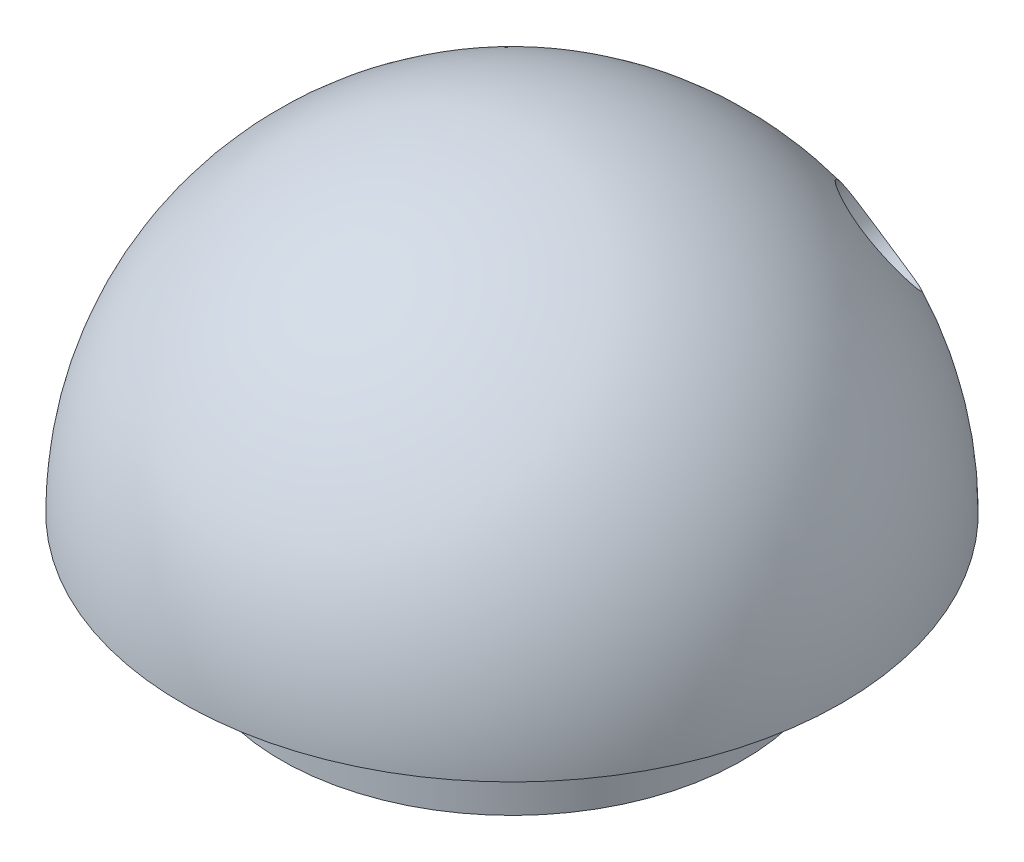
ISO-10303-21;
HEADER;
FILE_DESCRIPTION(('STEP AP214'),'2;1');
FILE_NAME('part.step','',(''),(''),'','','');
FILE_SCHEMA(('AUTOMOTIVE_DESIGN { 1 0 10303 214 1 1 1 1 }'));
ENDSEC;
DATA;
#1=APPLICATION_CONTEXT('core data for automotive mechanical design processes');
#2=APPLICATION_PROTOCOL_DEFINITION('international standard','automotive_design',2000,#1);
#3=PRODUCT_CONTEXT('',#1,'mechanical');
#4=PRODUCT('Part','Part','',(#3));
#5=PRODUCT_RELATED_PRODUCT_CATEGORY('part','',(#4));
#6=PRODUCT_DEFINITION_FORMATION('','',#4);
#7=PRODUCT_DEFINITION_CONTEXT('part definition',#1,'design');
#8=PRODUCT_DEFINITION('design','',#6,#7);
#9=PRODUCT_DEFINITION_SHAPE('','',#8);
#10=(LENGTH_UNIT() NAMED_UNIT(*) SI_UNIT(.MILLI.,.METRE.));
#11=(NAMED_UNIT(*) PLANE_ANGLE_UNIT() SI_UNIT($,.RADIAN.));
#12=(NAMED_UNIT(*) SI_UNIT($,.STERADIAN.) SOLID_ANGLE_UNIT());
#13=UNCERTAINTY_MEASURE_WITH_UNIT(LENGTH_MEASURE(1.E-05),#10,'distance_accuracy_value','');
#14=(GEOMETRIC_REPRESENTATION_CONTEXT(3) GLOBAL_UNCERTAINTY_ASSIGNED_CONTEXT((#13)) GLOBAL_UNIT_ASSIGNED_CONTEXT((#10,
#11,#12)) REPRESENTATION_CONTEXT('',''));
#15=CARTESIAN_POINT('',(0.,0.,0.));
#16=DIRECTION('',(0.,0.,1.));
#17=DIRECTION('',(1.,0.,0.));
#18=AXIS2_PLACEMENT_3D('',#15,#16,#17);
#19=CARTESIAN_POINT('',(15.,0.,0.));
#20=DIRECTION('',(0.,-1.,0.));
#21=DIRECTION('',(0.,0.,-1.));
#22=AXIS2_PLACEMENT_3D('',#19,#20,#21);
#23=PLANE('',#22);
#24=CARTESIAN_POINT('',(0.,0.,0.));
#25=DIRECTION('',(0.,-1.,0.));
#26=DIRECTION('',(0.,0.,-1.));
#27=AXIS2_PLACEMENT_3D('',#24,#25,#26);
#28=CIRCLE('',#27,17.5);
#29=CARTESIAN_POINT('',(0.,0.,-17.5));
#30=VERTEX_POINT('',#29);
#31=EDGE_CURVE('E10',#30,#30,#28,.T.);
#32=ORIENTED_EDGE('',*,*,#31,.T.);
#33=EDGE_LOOP('',(#32));
#34=FACE_BOUND('',#33,.T.);
#35=CARTESIAN_POINT('',(0.,0.,0.));
#36=DIRECTION('',(0.,-1.,0.));
#37=DIRECTION('',(0.,0.,-1.));
#38=AXIS2_PLACEMENT_3D('',#35,#36,#37);
#39=CIRCLE('',#38,15.);
#40=CARTESIAN_POINT('',(0.,0.,-15.));
#41=VERTEX_POINT('',#40);
#42=EDGE_CURVE('E115',#41,#41,#39,.T.);
#43=ORIENTED_EDGE('',*,*,#42,.F.);
#44=EDGE_LOOP('',(#43));
#45=FACE_BOUND('',#44,.T.);
#46=ADVANCED_FACE('F37',(#34,#45),#23,.T.);
#47=CARTESIAN_POINT('',(0.,0.,0.));
#48=DIRECTION('',(0.,-1.,0.));
#49=DIRECTION('',(0.,0.,-1.));
#50=AXIS2_PLACEMENT_3D('',#47,#48,#49);
#51=CYLINDRICAL_SURFACE('',#50,17.5);
#52=CARTESIAN_POINT('',(0.,7.5,0.));
#53=DIRECTION('',(0.,-1.,0.));
#54=DIRECTION('',(0.,0.,-1.));
#55=AXIS2_PLACEMENT_3D('',#52,#53,#54);
#56=CIRCLE('',#55,17.5);
#57=CARTESIAN_POINT('',(0.,7.5,-17.5));
#58=VERTEX_POINT('',#57);
#59=EDGE_CURVE('E50',#58,#58,#56,.T.);
#60=ORIENTED_EDGE('',*,*,#59,.T.);
#61=EDGE_LOOP('',(#60));
#62=FACE_BOUND('',#61,.T.);
#63=ORIENTED_EDGE('',*,*,#31,.F.);
#64=EDGE_LOOP('',(#63));
#65=FACE_BOUND('',#64,.T.);
#66=ADVANCED_FACE('F100',(#62,#65),#51,.T.);
#67=CARTESIAN_POINT('',(17.5,7.5,0.));
#68=DIRECTION('',(0.,-1.,0.));
#69=DIRECTION('',(0.,0.,-1.));
#70=AXIS2_PLACEMENT_3D('',#67,#68,#69);
#71=PLANE('',#70);
#72=CARTESIAN_POINT('',(0.,7.5,0.));
#73=DIRECTION('',(0.,-1.,0.));
#74=DIRECTION('',(0.,0.,-1.));
#75=AXIS2_PLACEMENT_3D('',#72,#73,#74);
#76=CIRCLE('',#75,25.);
#77=CARTESIAN_POINT('',(0.,7.5,-25.));
#78=VERTEX_POINT('',#77);
#79=EDGE_CURVE('E56',#78,#78,#76,.T.);
#80=ORIENTED_EDGE('',*,*,#79,.T.);
#81=EDGE_LOOP('',(#80));
#82=FACE_BOUND('',#81,.T.);
#83=ORIENTED_EDGE('',*,*,#59,.F.);
#84=EDGE_LOOP('',(#83));
#85=FACE_BOUND('',#84,.T.);
#86=ADVANCED_FACE('F96',(#82,#85),#71,.T.);
#87=CARTESIAN_POINT('',(0.,7.5,0.));
#88=DIRECTION('',(0.,-1.,0.));
#89=DIRECTION('',(1.,0.,0.));
#90=AXIS2_PLACEMENT_3D('',#87,#88,#89);
#91=SPHERICAL_SURFACE('',#90,25.);
#92=CARTESIAN_POINT('',(6.25615376132843,17.7963860629931,-21.9053640355272));
#93=CARTESIAN_POINT('',(6.18530853261183,17.8598773602726,-21.8957539216232));
#94=CARTESIAN_POINT('',(6.11707328099068,17.9258973139518,-21.8835833425738));
#95=CARTESIAN_POINT('',(5.98627087578441,18.0623590800766,-21.8542967360259));
#96=CARTESIAN_POINT('',(5.92370643525307,18.132802982048,-21.837178357614));
#97=CARTESIAN_POINT('',(5.80452764315806,18.2775200171955,-21.7982040112875));
#98=CARTESIAN_POINT('',(5.74792317265035,18.3517992143213,-21.7763403542723));
#99=CARTESIAN_POINT('',(5.64099343419435,18.503394607336,-21.728177589921));
#100=CARTESIAN_POINT('',(5.59067095453047,18.5807121319205,-21.7018765251184));
#101=CARTESIAN_POINT('',(5.44997969278555,18.8151541974207,-21.6171500484495));
#102=CARTESIAN_POINT('',(5.36901723398244,18.9758391330304,-21.5526093716431));
#103=CARTESIAN_POINT('',(5.23240734587209,19.3015131724903,-21.4098703816877));
#104=CARTESIAN_POINT('',(5.17675552257887,19.466501523995,-21.331674442389));
#105=CARTESIAN_POINT('',(5.08509325128873,19.8137203098701,-21.155566550009));
#106=CARTESIAN_POINT('',(5.05162712537946,19.9960128709896,-21.0564618699588));
#107=CARTESIAN_POINT('',(5.01164018242014,20.3572851393496,-20.847487003503));
#108=CARTESIAN_POINT('',(5.00513482011561,20.5362628879383,-20.7376106793844));
#109=CARTESIAN_POINT('',(5.0178433961382,20.9230843844761,-20.4867095871355));
#110=CARTESIAN_POINT('',(5.04245213585646,21.1295561935987,-20.3438460028755));
#111=CARTESIAN_POINT('',(5.12306725965867,21.5297750479752,-20.0495149718742));
#112=CARTESIAN_POINT('',(5.17909320785997,21.7235140802094,-19.8980422169012));
#113=CARTESIAN_POINT('',(5.33317133170666,22.1330152460234,-19.5582061333266));
#114=CARTESIAN_POINT('',(5.4374050298809,22.3453831970341,-19.3685446905883));
#115=CARTESIAN_POINT('',(5.6812946747763,22.744400248751,-18.9848052204471));
#116=CARTESIAN_POINT('',(5.8209855297742,22.9310237223994,-18.7907230131215));
#117=CARTESIAN_POINT('',(6.15503168719203,23.3007302621001,-18.3731646937419));
#118=CARTESIAN_POINT('',(6.35442023790692,23.4791896017891,-18.1495951660125));
#119=CARTESIAN_POINT('',(6.79057912513638,23.7921882587786,-17.7080004423529));
#120=CARTESIAN_POINT('',(7.0273378869575,23.9267411357976,-17.4899735538957));
#121=CARTESIAN_POINT('',(7.47516564380766,24.1187783895382,-17.1175049929497));
#122=CARTESIAN_POINT('',(7.67924416977037,24.186935463117,-16.9601398094682));
#123=CARTESIAN_POINT('',(8.10553421996632,24.2881379942026,-16.6592032696218));
#124=CARTESIAN_POINT('',(8.32771510488495,24.3212415049996,-16.5156094659465));
#125=CARTESIAN_POINT('',(8.72741304551039,24.3427529145637,-16.2847375663622));
#126=CARTESIAN_POINT('',(8.90155652512992,24.3405309528524,-16.1925157343167));
#127=CARTESIAN_POINT('',(9.25557110969807,24.3102086608935,-16.0246604275643));
#128=CARTESIAN_POINT('',(9.43543402024377,24.2821438745536,-15.9490043453904));
#129=CARTESIAN_POINT('',(9.76357604043401,24.2051104609197,-15.8315411452139));
#130=CARTESIAN_POINT('',(9.91164360176719,24.1608778061809,-15.7860791718398));
#131=CARTESIAN_POINT('',(10.2049236130692,24.0525243361429,-15.7130262405665));
#132=CARTESIAN_POINT('',(10.3501381462953,23.9884186530222,-15.6854217344232));
#133=CARTESIAN_POINT('',(10.6337900368796,23.8406240707229,-15.65032003748));
#134=CARTESIAN_POINT('',(10.7721926601394,23.7568453080969,-15.6429171438087));
#135=CARTESIAN_POINT('',(11.0366687911111,23.5723445480441,-15.6492071919684));
#136=CARTESIAN_POINT('',(11.1627422722654,23.4716225141217,-15.66290017924));
#137=CARTESIAN_POINT('',(11.3903392473715,23.2648248781566,-15.7083693790789));
#138=CARTESIAN_POINT('',(11.4929773928888,23.1596587976961,-15.7387706750387));
#139=CARTESIAN_POINT('',(11.6829867910022,22.9412851929287,-15.814453677858));
#140=CARTESIAN_POINT('',(11.7703518539206,22.8280744343994,-15.859741396378));
#141=CARTESIAN_POINT('',(11.9599579419783,22.5520362142558,-15.9824401350591));
#142=CARTESIAN_POINT('',(12.0550656137285,22.3868232778615,-16.0655104087656));
#143=CARTESIAN_POINT('',(12.2167260331314,22.0521008103273,-16.2490355354932));
#144=CARTESIAN_POINT('',(12.2832161240561,21.882582703324,-16.349527865674));
#145=CARTESIAN_POINT('',(12.4087795543407,21.4828412314033,-16.6006377060832));
#146=CARTESIAN_POINT('',(12.4568605006685,21.2524092269512,-16.7563928576763));
#147=CARTESIAN_POINT('',(12.5101877662471,20.79651747943,-17.0814862908509));
#148=CARTESIAN_POINT('',(12.5153953347083,20.5710624182162,-17.2508367208856));
#149=CARTESIAN_POINT('',(12.4867760657536,20.1232888518704,-17.6015919513755));
#150=CARTESIAN_POINT('',(12.4519714392165,19.9011891841563,-17.7831921458635));
#151=CARTESIAN_POINT('',(12.3447783610331,19.4694663704378,-18.1499728606128));
#152=CARTESIAN_POINT('',(12.2723827278231,19.2598456169968,-18.3351540584954));
#153=CARTESIAN_POINT('',(12.0730983138244,18.8142174953447,-18.7443384577768));
#154=CARTESIAN_POINT('',(11.9379799210655,18.5818589959906,-18.9683620034411));
#155=CARTESIAN_POINT('',(11.6180037579601,18.1475712217176,-19.4106360998626));
#156=CARTESIAN_POINT('',(11.4331454195055,17.945642294393,-19.6288865846512));
#157=CARTESIAN_POINT('',(11.0530876499743,17.6139545127306,-20.0154834531419));
#158=CARTESIAN_POINT('',(10.8655347814662,17.4777475839819,-20.1858163380744));
#159=CARTESIAN_POINT('',(10.4603148617605,17.2389747513299,-20.5138028004482));
#160=CARTESIAN_POINT('',(10.2426878413537,17.1363647294025,-20.6714727991193));
#161=CARTESIAN_POINT('',(9.82607481737887,16.9886769285971,-20.9395911197505));
#162=CARTESIAN_POINT('',(9.63175765599425,16.9362745824792,-21.0532460905224));
#163=CARTESIAN_POINT('',(9.22925427665412,16.8630301278561,-21.2651703687578));
#164=CARTESIAN_POINT('',(9.02108375691211,16.8421529110247,-21.3634566821454));
#165=CARTESIAN_POINT('',(8.62982192758483,16.836990797117,-21.5263611600337));
#166=CARTESIAN_POINT('',(8.44802528024217,16.8474013534856,-21.5938489034316));
#167=CARTESIAN_POINT('',(8.17413928529328,16.8837419503992,-21.6826712305231));
#168=CARTESIAN_POINT('',(8.08259720538549,16.8993232053499,-21.7102216281198));
#169=CARTESIAN_POINT('',(7.89977445753403,16.9375648620085,-21.7608658206657));
#170=CARTESIAN_POINT('',(7.80849369548186,16.9602222698891,-21.7839614936782));
#171=CARTESIAN_POINT('',(7.62630009753859,17.0128780114405,-21.8255398420449));
#172=CARTESIAN_POINT('',(7.53539391688961,17.0429249201058,-21.8439902881122));
#173=CARTESIAN_POINT('',(7.35542019109228,17.1102282707381,-21.8758036050251));
#174=CARTESIAN_POINT('',(7.26635178618517,17.1474812528166,-21.8891689083253));
#175=CARTESIAN_POINT('',(7.09097145257784,17.2289784421444,-21.9106036838496));
#176=CARTESIAN_POINT('',(7.00465565879243,17.2732122760416,-21.9186809237242));
#177=CARTESIAN_POINT('',(6.83550225750493,17.368385682146,-21.9294394294952));
#178=CARTESIAN_POINT('',(6.75266296326987,17.4193219516638,-21.9321233424746));
#179=CARTESIAN_POINT('',(6.59883607768964,17.5223599046468,-21.9320634402545));
#180=CARTESIAN_POINT('',(6.52746838667897,17.5738962691777,-21.9298087203524));
#181=CARTESIAN_POINT('',(6.38871580348601,17.6817042207569,-21.9208792432493));
#182=CARTESIAN_POINT('',(6.32133027719801,17.7379750504283,-21.9142051918439));
#183=CARTESIAN_POINT('',(6.25615376132843,17.7963860629931,-21.9053640355272));
#184=B_SPLINE_CURVE_WITH_KNOTS('',3,(#92,#93,#94,#95,#96,#97,#98,#99,#100,#101,#102,#103,#104,
#105,#106,#107,#108,#109,#110,#111,#112,#113,#114,#115,#116,#117,#118,#119,#120,#121,#122,#123,
#124,#125,#126,#127,#128,#129,#130,#131,#132,#133,#134,#135,#136,#137,#138,#139,#140,#141,#142,
#143,#144,#145,#146,#147,#148,#149,#150,#151,#152,#153,#154,#155,#156,#157,#158,#159,#160,#161,
#162,#163,#164,#165,#166,#167,#168,#169,#170,#171,#172,#173,#174,#175,#176,#177,#178,#179,#180,
#181,#182,#183),.UNSPECIFIED.,.T.,.F.,(4,2,2,2,2,2,2,2,2,2,2,2,2,2,2,2,2,2,2,2,2,2,2,2,2,2,2,2,
2,2,2,2,2,2,2,2,2,2,2,2,2,2,2,2,2,4),(0.,0.286754915414513,0.573646305094487,0.861006082166599,
1.14849295481882,1.71928961498301,2.28998714564219,2.9181927399411,3.54675839139589,
4.30083134781912,5.0553744026867,5.96149379364115,6.86850876098742,7.90994614840561,
8.95106160161093,9.74809287153766,10.543802078915,11.1330008330158,11.7213904187575,
12.2026580186147,12.6835600570166,13.1667030420251,13.6498470677271,14.0981579916972,
14.5466501822551,15.167047119225,15.788795557896,16.6310373175747,17.4740402478419,
18.3380898093931,19.2023045038244,20.2472420267086,21.2921914849231,22.1518437116009,
23.0103625095356,23.7011003019788,24.3910682774582,24.9710049585884,25.2612774344093,
25.5514272657532,25.8435379211876,26.1355086706336,26.4270495754318,26.7184473549011,
26.9822995754861,27.2461096673409),.UNSPECIFIED.);
#185=CARTESIAN_POINT('',(6.25615376132843,17.7963860629931,-21.9053640355272));
#186=VERTEX_POINT('',#185);
#187=EDGE_CURVE('E87',#186,#186,#184,.T.);
#188=ORIENTED_EDGE('',*,*,#187,.F.);
#189=EDGE_LOOP('',(#188));
#190=FACE_BOUND('',#189,.T.);
#191=CARTESIAN_POINT('',(-11.1750826639089,17.7211776991939,-19.8908283863683));
#192=CARTESIAN_POINT('',(-11.3680731711257,17.883776160168,-19.6988450731788));
#193=CARTESIAN_POINT('',(-11.5417563472017,18.0634147710452,-19.5013495270004));
#194=CARTESIAN_POINT('',(-11.8485588983902,18.4495033007404,-19.1003021326371));
#195=CARTESIAN_POINT('',(-11.9815595516088,18.6560292298511,-18.8967344262893));
#196=CARTESIAN_POINT('',(-12.2137574226773,19.1072029937043,-18.4720028254316));
#197=CARTESIAN_POINT('',(-12.3094188951063,19.3535769677245,-18.2507287260703));
#198=CARTESIAN_POINT('',(-12.4477296857758,19.8644675745505,-17.8126864323276));
#199=CARTESIAN_POINT('',(-12.4904184515026,20.128970552047,-17.5959150033443));
#200=CARTESIAN_POINT('',(-12.5150546062543,20.6161346751813,-17.2167340095071));
#201=CARTESIAN_POINT('',(-12.5074532128626,20.8365686798178,-17.0521307162234));
#202=CARTESIAN_POINT('',(-12.4511417455246,21.281851147843,-16.736326551494));
#203=CARTESIAN_POINT('',(-12.4024930334482,21.5066925328276,-16.5851060466631));
#204=CARTESIAN_POINT('',(-12.2781775538104,21.8955274775838,-16.341838264417));
#205=CARTESIAN_POINT('',(-12.213165701664,22.0597688404137,-16.2447611249443));
#206=CARTESIAN_POINT('',(-12.0561611527917,22.3842554045665,-16.0669892249752));
#207=CARTESIAN_POINT('',(-11.9642070151029,22.544505964221,-15.9862713289772));
#208=CARTESIAN_POINT('',(-11.7722198897538,22.8263537970788,-15.860146740653));
#209=CARTESIAN_POINT('',(-11.6770152736726,22.9495236294147,-15.8109476891124));
#210=CARTESIAN_POINT('',(-11.4685787829456,23.186110626729,-15.7303546834497));
#211=CARTESIAN_POINT('',(-11.3553608713697,23.2995352417219,-15.6989470235661));
#212=CARTESIAN_POINT('',(-11.1123500427909,23.5130599811698,-15.6564472844987));
#213=CARTESIAN_POINT('',(-10.9824706944511,23.6130846300323,-15.6454661317406));
#214=CARTESIAN_POINT('',(-10.7106960633939,23.7952177539126,-15.6452425948026));
#215=CARTESIAN_POINT('',(-10.5688022533343,23.8773284203147,-15.6559975500311));
#216=CARTESIAN_POINT('',(-10.2905117388925,24.0151997316076,-15.6963676154433));
#217=CARTESIAN_POINT('',(-10.1546732161354,24.072607046939,-15.7243016270873));
#218=CARTESIAN_POINT('',(-9.88087784457076,24.1701936596328,-15.795420689295));
#219=CARTESIAN_POINT('',(-9.74292013676226,24.2103657691341,-15.8386120892153));
#220=CARTESIAN_POINT('',(-9.4185185863043,24.2855251157174,-15.9555288201359));
#221=CARTESIAN_POINT('',(-9.23239764025847,24.3135077384211,-16.0346497180503));
#222=CARTESIAN_POINT('',(-8.86640329183848,24.3419930303374,-16.2103603384942));
#223=CARTESIAN_POINT('',(-8.6865431379049,24.3424405927131,-16.3069847039465));
#224=CARTESIAN_POINT('',(-8.27374771893253,24.3151090228097,-16.5491105919783));
#225=CARTESIAN_POINT('',(-8.04454168691682,24.2772898356184,-16.6998117084276));
#226=CARTESIAN_POINT('',(-7.60591464365567,24.1645710184339,-17.015246649358));
#227=CARTESIAN_POINT('',(-7.39652276509375,24.0896177691147,-17.1800004794828));
#228=CARTESIAN_POINT('',(-6.94889482994138,23.8846832811343,-17.5605996509448));
#229=CARTESIAN_POINT('',(-6.71683213013113,23.7455626628642,-17.7787969083347));
#230=CARTESIAN_POINT('',(-6.29013329768837,23.42434915902,-18.2200311832519));
#231=CARTESIAN_POINT('',(-6.09552086545149,23.2422292226037,-18.4430711668019));
#232=CARTESIAN_POINT('',(-5.74706786211795,22.8390929404543,-18.8892808788341));
#233=CARTESIAN_POINT('',(-5.59348836436654,22.617841753219,-19.1124427887519));
#234=CARTESIAN_POINT('',(-5.33498968737903,22.1422457373316,-19.5515658050033));
#235=CARTESIAN_POINT('',(-5.2300263207192,21.8879312304527,-19.7675332840023));
#236=CARTESIAN_POINT('',(-5.09205905344211,21.4055262428952,-20.144113316324));
#237=CARTESIAN_POINT('',(-5.0489023855666,21.1822622342444,-20.307199589824));
#238=CARTESIAN_POINT('',(-5.00419007933714,20.722688508554,-20.6202845493155));
#239=CARTESIAN_POINT('',(-5.00258532516856,20.486394524677,-20.770298478114));
#240=CARTESIAN_POINT('',(-5.04227276782432,20.0532659485662,-21.0247897566229));
#241=CARTESIAN_POINT('',(-5.07537941013441,19.8575762099348,-21.1324775843874));
#242=CARTESIAN_POINT('',(-5.17509727823084,19.4667479576824,-21.332272287773));
#243=CARTESIAN_POINT('',(-5.2416729257509,19.2716090795335,-21.4243955701899));
#244=CARTESIAN_POINT('',(-5.3972867728347,18.9176450737179,-21.5764442442689));
#245=CARTESIAN_POINT('',(-5.48131705255816,18.7578388886869,-21.639140577196));
#246=CARTESIAN_POINT('',(-5.62624725811954,18.5256731258899,-21.7207037415974));
#247=CARTESIAN_POINT('',(-5.67772716789672,18.4495152112178,-21.7458181679961));
#248=CARTESIAN_POINT('',(-5.78684690099425,18.3003576816898,-21.7915975864412));
#249=CARTESIAN_POINT('',(-5.84448415593313,18.2273567676833,-21.8122644229275));
#250=CARTESIAN_POINT('',(-5.96601700911926,18.0847880008485,-21.8489832448871));
#251=CARTESIAN_POINT('',(-6.02994566028179,18.0152415215096,-21.8650088998665));
#252=CARTESIAN_POINT('',(-6.16338607211305,17.8807325470576,-21.8920582892966));
#253=CARTESIAN_POINT('',(-6.23289533285324,17.8157680236102,-21.9030842488915));
#254=CARTESIAN_POINT('',(-6.37701845913276,17.6910444743921,-21.9199772065853));
#255=CARTESIAN_POINT('',(-6.45163196289007,17.6312850803698,-21.9258445699112));
#256=CARTESIAN_POINT('',(-6.60535461891411,17.5175512750174,-21.9323302089034));
#257=CARTESIAN_POINT('',(-6.68446341601916,17.4635764076365,-21.9329488986751));
#258=CARTESIAN_POINT('',(-6.83916686533415,17.3664859613865,-21.9291090266707));
#259=CARTESIAN_POINT('',(-6.91443416077387,17.3228299435789,-21.9251037224129));
#260=CARTESIAN_POINT('',(-7.06755016776511,17.240973252151,-21.9127990418121));
#261=CARTESIAN_POINT('',(-7.14539974246235,17.2027744257466,-21.9044982158431));
#262=CARTESIAN_POINT('',(-7.38186609198615,17.0967362738717,-21.8732920850595));
#263=CARTESIAN_POINT('',(-7.54356781278003,17.0373508165875,-21.8440786989354));
#264=CARTESIAN_POINT('',(-7.87080428287704,16.9416848325794,-21.7700628114883));
#265=CARTESIAN_POINT('',(-8.0363523863941,16.9055034264456,-21.7251946802701));
#266=CARTESIAN_POINT('',(-8.36652242496952,16.8558675650034,-21.6217389655614));
#267=CARTESIAN_POINT('',(-8.53114412208561,16.8424187046674,-21.5631480086246));
#268=CARTESIAN_POINT('',(-8.87339057525661,16.8364562487169,-21.4273410504291));
#269=CARTESIAN_POINT('',(-9.05052655410605,16.8463317139358,-21.3488042550534));
#270=CARTESIAN_POINT('',(-9.39611034334577,16.8894486187105,-21.1799168940097));
#271=CARTESIAN_POINT('',(-9.564551212077,16.9227084264791,-21.0895570869034));
#272=CARTESIAN_POINT('',(-9.91881294200915,17.0174203925579,-20.8827097262139));
#273=CARTESIAN_POINT('',(-10.1025240865778,17.0827847267219,-20.7644161245753));
#274=CARTESIAN_POINT('',(-10.4520409960691,17.2375623596825,-20.5179535110751));
#275=CARTESIAN_POINT('',(-10.6178558261323,17.3269634021206,-20.3897895558236));
#276=CARTESIAN_POINT('',(-10.8448651723798,17.4716042001721,-20.1981849065957));
#277=CARTESIAN_POINT('',(-10.9137597818235,17.5188519876769,-20.1376037319635));
#278=CARTESIAN_POINT('',(-11.0474772683906,17.6171922278984,-20.0151519713577));
#279=CARTESIAN_POINT('',(-11.112301559955,17.6682833313394,-19.9532818433625));
#280=CARTESIAN_POINT('',(-11.1750826639089,17.7211776991939,-19.8908283863683));
#281=B_SPLINE_CURVE_WITH_KNOTS('',3,(#191,#192,#193,#194,#195,#196,#197,#198,#199,#200,#201,
#202,#203,#204,#205,#206,#207,#208,#209,#210,#211,#212,#213,#214,#215,#216,#217,#218,#219,#220,
#221,#222,#223,#224,#225,#226,#227,#228,#229,#230,#231,#232,#233,#234,#235,#236,#237,#238,#239,
#240,#241,#242,#243,#244,#245,#246,#247,#248,#249,#250,#251,#252,#253,#254,#255,#256,#257,#258,
#259,#260,#261,#262,#263,#264,#265,#266,#267,#268,#269,#270,#271,#272,#273,#274,#275,#276,#277,
#278,#279,#280),.UNSPECIFIED.,.T.,.F.,(4,2,2,2,2,2,2,2,2,2,2,2,2,2,2,2,2,2,2,2,2,2,2,2,2,2,2,2,
2,2,2,2,2,2,2,2,2,2,2,2,2,2,2,2,4),(0.,0.950913845763542,1.90457679082037,2.93419082723544,
3.96303767410689,4.78586786246309,5.60747017218046,6.21012380480968,6.81191911480447,
7.29973964576986,7.78718386686754,8.27726751851032,8.76729118547385,9.21565618941792,
9.66420800053434,10.2733388734859,10.8836887808447,11.7099254657288,12.5373586785584,
13.5748601204222,14.6130160010676,15.6576278442789,16.7012883627975,17.5376234747576,
18.3729699641906,19.0477620384126,19.7218383062796,20.2925814549904,20.5781628483142,
20.8636255802723,21.1506774315416,21.4376014029764,21.7245050586467,22.0113860782211,
22.2723717623788,22.5334455798627,23.0550088869841,23.5787855683103,24.1026911436743,
24.6825448531297,25.2628545426033,25.9446166506644,26.6260317841972,26.9354785592251,
27.2448171990526),.UNSPECIFIED.);
#282=CARTESIAN_POINT('',(-11.1750826639089,17.7211776991939,-19.8908283863683));
#283=VERTEX_POINT('',#282);
#284=EDGE_CURVE('E66',#283,#283,#281,.T.);
#285=ORIENTED_EDGE('',*,*,#284,.F.);
#286=EDGE_LOOP('',(#285));
#287=FACE_BOUND('',#286,.T.);
#288=ORIENTED_EDGE('',*,*,#79,.F.);
#289=EDGE_LOOP('',(#288));
#290=FACE_BOUND('',#289,.T.);
#291=ADVANCED_FACE('F92',(#190,#287,#290),#91,.T.);
#292=CARTESIAN_POINT('',(0.,7.5,0.));
#293=DIRECTION('',(0.,-1.,0.));
#294=DIRECTION('',(1.,0.,0.));
#295=AXIS2_PLACEMENT_3D('',#292,#293,#294);
#296=SPHERICAL_SURFACE('',#295,22.5);
#297=CARTESIAN_POINT('',(6.32527355268885,17.7359506630439,-19.0122651215958));
#298=CARTESIAN_POINT('',(6.38915211765011,17.6814640127201,-19.0203479035218));
#299=CARTESIAN_POINT('',(6.45504027094713,17.628973951879,-19.0261255989902));
#300=CARTESIAN_POINT('',(6.59039089219199,17.5284290112648,-19.0329841062497));
#301=CARTESIAN_POINT('',(6.65985492771947,17.4803761028673,-19.0340628400806));
#302=CARTESIAN_POINT('',(6.80189676664031,17.3890498582347,-19.0315010373122));
#303=CARTESIAN_POINT('',(6.87447832310958,17.3457825205762,-19.0278546490665));
#304=CARTESIAN_POINT('',(7.02212438912977,17.2643769908497,-19.0158843496181));
#305=CARTESIAN_POINT('',(7.09718987424918,17.2262408445877,-19.0075585795547));
#306=CARTESIAN_POINT('',(7.24892894990335,17.1554363790873,-18.9863812369295));
#307=CARTESIAN_POINT('',(7.32559637637789,17.122750332589,-18.9735447769053));
#308=CARTESIAN_POINT('',(7.48019504404473,17.0627863985542,-18.9435189380438));
#309=CARTESIAN_POINT('',(7.55812676513991,17.0355106191978,-18.926327868295));
#310=CARTESIAN_POINT('',(7.79285709886347,16.9618870068917,-18.8685554414813));
#311=CARTESIAN_POINT('',(7.95076716058701,16.9236616261876,-18.8217497336513));
#312=CARTESIAN_POINT('',(8.27055210930544,16.8672804613323,-18.7118263374541));
#313=CARTESIAN_POINT('',(8.43237639962623,16.8498607076274,-18.6482026731658));
#314=CARTESIAN_POINT('',(8.75117005953248,16.8356306591983,-18.5079293041632));
#315=CARTESIAN_POINT('',(8.90813674190671,16.8388315739778,-18.4312725366319));
#316=CARTESIAN_POINT('',(9.28540962070358,16.8693797984382,-18.2293884652815));
#317=CARTESIAN_POINT('',(9.50162085689933,16.9071615766623,-18.0980438882712));
#318=CARTESIAN_POINT('',(9.91407844609999,17.0149903046333,-17.8182865177955));
#319=CARTESIAN_POINT('',(10.1102823534669,17.0851041767237,-17.6698388039414));
#320=CARTESIAN_POINT('',(10.5396294777276,17.2779549224138,-17.3110080903816));
#321=CARTESIAN_POINT('',(10.7645413971475,17.410348033167,-17.0959921572086));
#322=CARTESIAN_POINT('',(11.1739898079081,17.7090632051798,-16.6517505879868));
#323=CARTESIAN_POINT('',(11.3584853382818,17.8754193603419,-16.422510835552));
#324=CARTESIAN_POINT('',(11.6251721870648,18.1662263076467,-16.0431097694183));
#325=CARTESIAN_POINT('',(11.719776293117,18.2829826041961,-15.8955478843707));
#326=CARTESIAN_POINT('',(11.8932316957346,18.5249053690077,-15.5979732883197));
#327=CARTESIAN_POINT('',(11.9720790120249,18.6500739516286,-15.4479599683933));
#328=CARTESIAN_POINT('',(12.1140649205939,18.9076579100299,-15.1462617719104));
#329=CARTESIAN_POINT('',(12.1771765000645,19.0400852778196,-14.9945744814262));
#330=CARTESIAN_POINT('',(12.2873827235595,19.3108897574418,-14.6907300799553));
#331=CARTESIAN_POINT('',(12.3344792200126,19.4492661790736,-14.538573025361));
#332=CARTESIAN_POINT('',(12.4127010735457,19.7323237954989,-14.2334233824575));
#333=CARTESIAN_POINT('',(12.4436818475125,19.8770498461546,-14.0804352673363));
#334=CARTESIAN_POINT('',(12.4884764247023,20.1709301700084,-13.77609324953));
#335=CARTESIAN_POINT('',(12.5022850593873,20.3200857626035,-13.6247398524501));
#336=CARTESIAN_POINT('',(12.511776320331,20.6217193785747,-13.3255751669847));
#337=CARTESIAN_POINT('',(12.5075078992282,20.7741873181789,-13.1777554012087));
#338=CARTESIAN_POINT('',(12.4795441104009,21.082098190994,-12.8873009130257));
#339=CARTESIAN_POINT('',(12.4558653231014,21.2375384745771,-12.7446618737749));
#340=CARTESIAN_POINT('',(12.3865397800724,21.5529261530042,-12.465355837421));
#341=CARTESIAN_POINT('',(12.3405989814714,21.7129060898114,-12.3287962847001));
#342=CARTESIAN_POINT('',(12.2235095506692,22.0340429215464,-12.0682833512918));
#343=CARTESIAN_POINT('',(12.1523867061758,22.1951984478746,-11.9443172407819));
#344=CARTESIAN_POINT('',(11.9993533822609,22.4817189732268,-11.7406173889214));
#345=CARTESIAN_POINT('',(11.9230373410252,22.6073396817537,-11.6571012777883));
#346=CARTESIAN_POINT('',(11.7504314192261,22.8552692373733,-11.507447824028));
#347=CARTESIAN_POINT('',(11.6541771479298,22.9775835552378,-11.4412799687204));
#348=CARTESIAN_POINT('',(11.4652645935975,23.1877135644394,-11.3450563038246));
#349=CARTESIAN_POINT('',(11.3767682155449,23.2770480930411,-11.3102098681567));
#350=CARTESIAN_POINT('',(11.1883713815665,23.4484408570328,-11.2576395178136));
#351=CARTESIAN_POINT('',(11.0884828489026,23.5305065431362,-11.2398978815157));
#352=CARTESIAN_POINT('',(10.8792493202933,23.6847473245605,-11.2233200942996));
#353=CARTESIAN_POINT('',(10.7698699086878,23.7568837430861,-11.2245558729362));
#354=CARTESIAN_POINT('',(10.5455456387176,23.8886121838512,-11.2459727308386));
#355=CARTESIAN_POINT('',(10.4305981128315,23.948198118934,-11.266162977494));
#356=CARTESIAN_POINT('',(10.2041552772953,24.051463798413,-11.3220928321519));
#357=CARTESIAN_POINT('',(10.0927417384935,24.0957452244327,-11.3570809747345));
#358=CARTESIAN_POINT('',(9.87061903588674,24.1723687686532,-11.4397788519846));
#359=CARTESIAN_POINT('',(9.75991017165151,24.2047061041433,-11.4874936695873));
#360=CARTESIAN_POINT('',(9.47012357086549,24.2756272273967,-11.626992172339));
#361=CARTESIAN_POINT('',(9.29290125878528,24.3048365734906,-11.727374173606));
#362=CARTESIAN_POINT('',(8.94727483804565,24.3383323506727,-11.9460954059732));
#363=CARTESIAN_POINT('',(8.77890039618449,24.3425396538371,-12.0644904346288));
#364=CARTESIAN_POINT('',(8.4872435084368,24.331362303242,-12.2860856703071));
#365=CARTESIAN_POINT('',(8.36206172931479,24.3200034482232,-12.387063839551));
#366=CARTESIAN_POINT('',(8.11764972074707,24.2858497612068,-12.5942439848983));
#367=CARTESIAN_POINT('',(7.99842278504708,24.2630486756414,-12.700448788876));
#368=CARTESIAN_POINT('',(7.76580466485189,24.2071134342515,-12.9166818327202));
#369=CARTESIAN_POINT('',(7.65242015362769,24.1739677547619,-13.0267142143675));
#370=CARTESIAN_POINT('',(7.43160165747195,24.0982112841006,-13.2494039922955));
#371=CARTESIAN_POINT('',(7.32416724075277,24.0556011808724,-13.3620611972524));
#372=CARTESIAN_POINT('',(7.08042015667816,23.9458893573881,-13.6270544928525));
#373=CARTESIAN_POINT('',(6.94641468686458,23.8753578659287,-13.7801026239313));
#374=CARTESIAN_POINT('',(6.68922155814775,23.7197639789293,-14.0879338362147));
#375=CARTESIAN_POINT('',(6.56603729789846,23.6346970427233,-14.2427174453972));
#376=CARTESIAN_POINT('',(6.33092944073678,23.4508009724524,-14.5529257335298));
#377=CARTESIAN_POINT('',(6.21901592235987,23.3519597060607,-14.7083508591195));
#378=CARTESIAN_POINT('',(6.00736358640367,23.1412522049162,-15.0186275887699));
#379=CARTESIAN_POINT('',(5.90762320734176,23.029387644302,-15.1734792639127));
#380=CARTESIAN_POINT('',(5.72083497300214,22.7925577538172,-15.4824605117448));
#381=CARTESIAN_POINT('',(5.63385841108944,22.6675250753933,-15.6365816964892));
#382=CARTESIAN_POINT('',(5.47457233108458,22.4054099575736,-15.9422299492881));
#383=CARTESIAN_POINT('',(5.40226570686172,22.2683251483407,-16.0937565001241));
#384=CARTESIAN_POINT('',(5.27415115761867,21.9831027734292,-16.3926727863696));
#385=CARTESIAN_POINT('',(5.21830514187811,21.8349917347685,-16.5400713467017));
#386=CARTESIAN_POINT('',(5.12489829379111,21.5283198449181,-16.8296859032223));
#387=CARTESIAN_POINT('',(5.08733423631208,21.3697608424684,-16.9719028094117));
#388=CARTESIAN_POINT('',(5.02581731027514,21.0012800099727,-17.2852620909196));
#389=CARTESIAN_POINT('',(5.00783919442712,20.7886265789117,-17.454450918367));
#390=CARTESIAN_POINT('',(5.01003554499508,20.3522650982036,-17.7775795150779));
#391=CARTESIAN_POINT('',(5.03015334421787,20.1285739490285,-17.9315415755444));
#392=CARTESIAN_POINT('',(5.10580112468934,19.7224943541039,-18.1889500484652));
#393=CARTESIAN_POINT('',(5.15319794113565,19.5410721378743,-18.2962737024913));
#394=CARTESIAN_POINT('',(5.27866224391258,19.1793875428667,-18.493889191302));
#395=CARTESIAN_POINT('',(5.35670898038474,18.9991244630981,-18.5841924877096));
#396=CARTESIAN_POINT('',(5.52885522355231,18.676786017909,-18.7294643825216));
#397=CARTESIAN_POINT('',(5.61779170401146,18.5335275583689,-18.7878478175954));
#398=CARTESIAN_POINT('',(5.76743276171869,18.32606668259,-18.8624201571457));
#399=CARTESIAN_POINT('',(5.81997205242732,18.2582007221611,-18.8850978817174));
#400=CARTESIAN_POINT('',(5.93032063889801,18.1254615661509,-18.9258741875553));
#401=CARTESIAN_POINT('',(5.98812727804868,18.0605868864972,-18.943975059978));
#402=CARTESIAN_POINT('',(6.09204064646678,17.9519014547374,-18.9710018716872));
#403=CARTESIAN_POINT('',(6.13695705209842,17.907230656478,-18.9810805831528));
#404=CARTESIAN_POINT('',(6.22928557630024,17.8199714727864,-18.9986394683106));
#405=CARTESIAN_POINT('',(6.27669854245715,17.77738380417,-19.0061187528571));
#406=CARTESIAN_POINT('',(6.32527355268885,17.7359506630439,-19.0122651215958));
#407=B_SPLINE_CURVE_WITH_KNOTS('',3,(#297,#298,#299,#300,#301,#302,#303,#304,#305,#306,#307,
#308,#309,#310,#311,#312,#313,#314,#315,#316,#317,#318,#319,#320,#321,#322,#323,#324,#325,#326,
#327,#328,#329,#330,#331,#332,#333,#334,#335,#336,#337,#338,#339,#340,#341,#342,#343,#344,#345,
#346,#347,#348,#349,#350,#351,#352,#353,#354,#355,#356,#357,#358,#359,#360,#361,#362,#363,#364,
#365,#366,#367,#368,#369,#370,#371,#372,#373,#374,#375,#376,#377,#378,#379,#380,#381,#382,#383,
#384,#385,#386,#387,#388,#389,#390,#391,#392,#393,#394,#395,#396,#397,#398,#399,#400,#401,#402,
#403,#404,#405,#406),.UNSPECIFIED.,.T.,.F.,(4,2,2,2,2,2,2,2,2,2,2,2,2,2,2,2,2,2,2,2,2,2,2,2,2,2,
2,2,2,2,2,2,2,2,2,2,2,2,2,2,2,2,2,2,2,2,2,2,2,2,2,2,2,2,4),(0.,0.252982543017918,
0.506076947830302,0.759485087457039,1.01299396339987,1.26566146084761,1.51842722084709,
2.02337870265589,2.54570945631007,3.06832417565428,3.83145112584982,4.59616476798949,
5.60524646451094,6.61534615594188,7.24647357666833,7.87776022362754,8.51012322311568,
9.14241305369538,9.78028170946742,10.4183423070224,11.0546761439039,11.6904669871863,
12.3348943929449,12.9786637716132,13.484218233579,13.9888774525651,14.3787488943856,
14.7682159699788,15.1591595946737,15.5502923979788,15.9235798352582,16.2970165844695,
16.9107957075946,17.5265163245001,18.0095796167318,18.4929072074641,18.9767751486658,
19.4606079303103,20.10567441919,20.7509427872976,21.3967831379829,22.042540557657,
22.6917778121872,23.3411430144243,23.9889935364574,24.6367297292792,25.4508477051399,
26.2637556419523,26.9094922404467,27.5547924296977,28.0877073597583,28.353751653105,
28.6196625007418,28.8119716392352,29.0043464933509),.UNSPECIFIED.);
#408=CARTESIAN_POINT('',(6.32527355268885,17.7359506630439,-19.0122651215958));
#409=VERTEX_POINT('',#408);
#410=EDGE_CURVE('E40',#409,#409,#407,.T.);
#411=ORIENTED_EDGE('',*,*,#410,.F.);
#412=EDGE_LOOP('',(#411));
#413=FACE_BOUND('',#412,.T.);
#414=CARTESIAN_POINT('',(-10.7222925373784,17.3940934503012,-17.1286122473694));
#415=CARTESIAN_POINT('',(-10.5135480037656,17.2658082140638,-17.3333827016335));
#416=CARTESIAN_POINT('',(-10.2864619317277,17.1543897362246,-17.5309415423894));
#417=CARTESIAN_POINT('',(-9.79817894298347,16.9765772185115,-17.9036927086049));
#418=CARTESIAN_POINT('',(-9.5370002861087,16.9101591936522,-18.0788969084761));
#419=CARTESIAN_POINT('',(-9.0881276577686,16.8493789645902,-18.3381043586887));
#420=CARTESIAN_POINT('',(-8.90856804682045,16.837532814984,-18.4320038581217));
#421=CARTESIAN_POINT('',(-8.63366568585709,16.8399893303476,-18.5602979537287));
#422=CARTESIAN_POINT('',(-8.54109815781569,16.8441800632242,-18.6009723813236));
#423=CARTESIAN_POINT('',(-8.35466685493384,16.8596982560101,-18.6776818388078));
#424=CARTESIAN_POINT('',(-8.26080366105344,16.8710226128461,-18.7137188777224));
#425=CARTESIAN_POINT('',(-8.07151098376706,16.9012989774289,-18.7810199731154));
#426=CARTESIAN_POINT('',(-7.97607520149461,16.9203255866702,-18.8122330985713));
#427=CARTESIAN_POINT('',(-7.78544442039228,16.9662441412811,-18.8689556184897));
#428=CARTESIAN_POINT('',(-7.69024931879111,16.9931318006654,-18.8944681077036));
#429=CARTESIAN_POINT('',(-7.50103927871063,17.0548714621671,-18.9393570022194));
#430=CARTESIAN_POINT('',(-7.40702383507259,17.0897199233066,-18.9587361265376));
#431=CARTESIAN_POINT('',(-7.22116720907742,17.1673187972451,-18.9910001900533));
#432=CARTESIAN_POINT('',(-7.1293256397983,17.2100677917364,-19.0038862933364));
#433=CARTESIAN_POINT('',(-6.9615650158704,17.2966446197689,-19.021568022574));
#434=CARTESIAN_POINT('',(-6.88522241495858,17.3394762174992,-19.0272462529467));
#435=CARTESIAN_POINT('',(-6.73554666671979,17.4304998421027,-19.0335300952847));
#436=CARTESIAN_POINT('',(-6.6622144780179,17.4786935586199,-19.0341341037115));
#437=CARTESIAN_POINT('',(-6.51924936829573,17.5800051855388,-19.0302536566015));
#438=CARTESIAN_POINT('',(-6.44961388375261,17.633119611554,-19.025772776795));
#439=CARTESIAN_POINT('',(-6.31451248001825,17.7438213507753,-19.011805421629));
#440=CARTESIAN_POINT('',(-6.24904813352014,17.8014103331243,-19.0023170706147));
#441=CARTESIAN_POINT('',(-6.06834952576908,17.9718623617866,-18.9681780281318));
#442=CARTESIAN_POINT('',(-5.95876727651304,18.0896427095918,-18.9375059874538));
#443=CARTESIAN_POINT('',(-5.75770001467314,18.335005009641,-18.8607593747386));
#444=CARTESIAN_POINT('',(-5.66621698063353,18.4625880313656,-18.8146831202447));
#445=CARTESIAN_POINT('',(-5.49595581983089,18.7334494460296,-18.7052043257747));
#446=CARTESIAN_POINT('',(-5.41857872942341,18.8771952450819,-18.6407881985519));
#447=CARTESIAN_POINT('',(-5.28488980455945,19.1679353604227,-18.498917196252));
#448=CARTESIAN_POINT('',(-5.22859108964228,19.3149316397922,-18.4214542439473));
#449=CARTESIAN_POINT('',(-5.11453444018728,19.676943683038,-18.2175426757026));
#450=CARTESIAN_POINT('',(-5.06805642000314,19.8920927472862,-18.0849688194657));
#451=CARTESIAN_POINT('',(-5.0127098702167,20.3160056770253,-17.8027717895309));
#452=CARTESIAN_POINT('',(-5.0039219196398,20.5247549157205,-17.6531127889293));
#453=CARTESIAN_POINT('',(-5.02143511048614,20.9964745370914,-17.2914608279957));
#454=CARTESIAN_POINT('',(-5.05985721510407,21.2554342482392,-17.0748399809341));
#455=CARTESIAN_POINT('',(-5.18356443076463,21.7484400325641,-16.6276130246012));
#456=CARTESIAN_POINT('',(-5.26887911087816,21.9824702746809,-16.3969981728339));
#457=CARTESIAN_POINT('',(-5.48077208250205,22.4270433058338,-15.9221225024659));
#458=CARTESIAN_POINT('',(-5.60818729709,22.6369825537398,-15.6776759877963));
#459=CARTESIAN_POINT('',(-5.89777409895473,23.0252524305106,-15.1839538820423));
#460=CARTESIAN_POINT('',(-6.05997559098188,23.2035556202488,-14.9346743048964));
#461=CARTESIAN_POINT('',(-6.34561268634918,23.4630361252086,-14.5330432462522));
#462=CARTESIAN_POINT('',(-6.45954830835098,23.5549975207003,-14.3807472849351));
#463=CARTESIAN_POINT('',(-6.69821800430536,23.7255220986484,-14.0769623691231));
#464=CARTESIAN_POINT('',(-6.82295556941124,23.8040809248893,-13.9254736924587));
#465=CARTESIAN_POINT('',(-7.08265315754409,23.9467971032696,-13.6247356413742));
#466=CARTESIAN_POINT('',(-7.21760380450572,24.0109674552133,-13.475484360213));
#467=CARTESIAN_POINT('',(-7.49757362860621,24.1237531068801,-13.1807315463903));
#468=CARTESIAN_POINT('',(-7.64258645153998,24.1723781165327,-13.0352277254236));
#469=CARTESIAN_POINT('',(-7.96686482742692,24.2588615960689,-12.7271165657246));
#470=CARTESIAN_POINT('',(-8.14789621416437,24.2937477002466,-12.5655030692959));
#471=CARTESIAN_POINT('',(-8.52376969789132,24.3364119608763,-12.2552124186214));
#472=CARTESIAN_POINT('',(-8.71859113784121,24.3442298230391,-12.1065166283709));
#473=CARTESIAN_POINT('',(-9.06743448277598,24.3292094729308,-11.8676582372105));
#474=CARTESIAN_POINT('',(-9.21833096209319,24.3140532866195,-11.7725109994228));
#475=CARTESIAN_POINT('',(-9.52622208084196,24.2629755675306,-11.5989430637674));
#476=CARTESIAN_POINT('',(-9.68320590460968,24.2270894196329,-11.520494174247));
#477=CARTESIAN_POINT('',(-9.96133379307851,24.1432071017894,-11.4036690042647));
#478=CARTESIAN_POINT('',(-10.0818451585423,24.1003250725353,-11.3601842118153));
#479=CARTESIAN_POINT('',(-10.3218752458427,24.0002408424138,-11.2902182111889));
#480=CARTESIAN_POINT('',(-10.4413949449105,23.9430550671644,-11.2637176228046));
#481=CARTESIAN_POINT('',(-10.6765046762364,23.8144347510382,-11.230307741244));
#482=CARTESIAN_POINT('',(-10.7920653022922,23.7429129477805,-11.2235225787419));
#483=CARTESIAN_POINT('',(-11.014271894119,23.5880370738398,-11.2307271031229));
#484=CARTESIAN_POINT('',(-11.1209165979999,23.5046813327629,-11.2447197254912));
#485=CARTESIAN_POINT('',(-11.3133385114404,23.3371407430332,-11.289758339692));
#486=CARTESIAN_POINT('',(-11.4001247983851,23.2536643454467,-11.3192079273784));
#487=CARTESIAN_POINT('',(-11.562676634603,23.0820662622571,-11.3916207156448));
#488=CARTESIAN_POINT('',(-11.6384372400258,22.9939425167907,-11.4345899512174));
#489=CARTESIAN_POINT('',(-11.8180590816465,22.7651132192302,-11.5584084258423));
#490=CARTESIAN_POINT('',(-11.914064351851,22.6224626299772,-11.647025067321));
#491=CARTESIAN_POINT('',(-12.0817856631174,22.3350807701981,-11.8422230343331));
#492=CARTESIAN_POINT('',(-12.1534299260646,22.1903446386225,-11.9488560857268));
#493=CARTESIAN_POINT('',(-12.2620143287771,21.9327670356548,-12.1495298033538));
#494=CARTESIAN_POINT('',(-12.303112531334,21.8198278726977,-12.241273093967));
#495=CARTESIAN_POINT('',(-12.3734418801374,21.5947247592038,-12.4301853373904));
#496=CARTESIAN_POINT('',(-12.4026664963188,21.4825612684997,-12.5273572424286));
#497=CARTESIAN_POINT('',(-12.4502647124584,21.2593193376723,-12.7257588188952));
#498=CARTESIAN_POINT('',(-12.468624826459,21.1482424136975,-12.8269933675672));
#499=CARTESIAN_POINT('',(-12.4952278598128,20.9275964228368,-13.032337837203));
#500=CARTESIAN_POINT('',(-12.5034714665385,20.8180272540058,-13.1364475623194));
#501=CARTESIAN_POINT('',(-12.5118309710178,20.5576290743952,-13.3883137150625));
#502=CARTESIAN_POINT('',(-12.507448388652,20.4076036079978,-13.5370620537528));
#503=CARTESIAN_POINT('',(-12.4813298936649,20.1114782934013,-13.8369661282659));
#504=CARTESIAN_POINT('',(-12.4595874752407,19.965379938155,-13.9881227458021));
#505=CARTESIAN_POINT('',(-12.3994261944826,19.6776263484788,-14.2917584527272));
#506=CARTESIAN_POINT('',(-12.3609833918586,19.5359778066894,-14.4442391315039));
#507=CARTESIAN_POINT('',(-12.2678590780327,19.2581936108572,-14.7492109069684));
#508=CARTESIAN_POINT('',(-12.2131802858993,19.1220570380503,-14.9017019976408));
#509=CARTESIAN_POINT('',(-12.0870878036662,18.8547496007176,-15.2074881813452));
#510=CARTESIAN_POINT('',(-12.0154906256959,18.723652941778,-15.3607726539765));
#511=CARTESIAN_POINT('',(-11.8559595442394,18.469301133704,-15.6654526433065));
#512=CARTESIAN_POINT('',(-11.7680209308139,18.3460482590943,-15.8168476019491));
#513=CARTESIAN_POINT('',(-11.5762607377002,18.1095019116803,-16.1159549860169));
#514=CARTESIAN_POINT('',(-11.4725137039395,17.9961654328088,-16.2636810958487));
#515=CARTESIAN_POINT('',(-11.2488394096448,17.7806844412848,-16.5549511432965));
#516=CARTESIAN_POINT('',(-11.1289215775035,17.6785334693383,-16.698497459082));
#517=CARTESIAN_POINT('',(-10.956507118198,17.5499307685801,-16.8881414800266));
#518=CARTESIAN_POINT('',(-10.911054670992,17.5175642492211,-16.9367280863465));
#519=CARTESIAN_POINT('',(-10.8181628817778,17.454525698231,-17.0332105020229));
#520=CARTESIAN_POINT('',(-10.7707213180566,17.4238556551478,-17.0811054540306));
#521=CARTESIAN_POINT('',(-10.7222925373784,17.3940934503012,-17.1286122473694));
#522=B_SPLINE_CURVE_WITH_KNOTS('',3,(#414,#415,#416,#417,#418,#419,#420,#421,#422,#423,#424,
#425,#426,#427,#428,#429,#430,#431,#432,#433,#434,#435,#436,#437,#438,#439,#440,#441,#442,#443,
#444,#445,#446,#447,#448,#449,#450,#451,#452,#453,#454,#455,#456,#457,#458,#459,#460,#461,#462,
#463,#464,#465,#466,#467,#468,#469,#470,#471,#472,#473,#474,#475,#476,#477,#478,#479,#480,#481,
#482,#483,#484,#485,#486,#487,#488,#489,#490,#491,#492,#493,#494,#495,#496,#497,#498,#499,#500,
#501,#502,#503,#504,#505,#506,#507,#508,#509,#510,#511,#512,#513,#514,#515,#516,#517,#518,#519,
#520,#521),.UNSPECIFIED.,.T.,.F.,(4,2,2,2,2,2,2,2,2,2,2,2,2,2,2,2,2,2,2,2,2,2,2,2,2,2,2,2,2,2,2,
2,2,2,2,2,2,2,2,2,2,2,2,2,2,2,2,2,2,2,2,2,2,4),(0.,0.957644358547815,1.9147778957237,
2.52124866643683,2.82452381454838,3.12766713124175,3.43381966017595,3.73980557956224,
4.04565565999832,4.35145088731222,4.61426359692968,4.87715935660935,5.13987036058229,
5.4026798384708,5.89165892172677,6.38069142900247,6.90516133253889,7.42995713451122,
8.19655847188394,8.96479794080692,9.97873378918387,10.9933097302304,12.0294075731324,
13.0663997153428,13.6995821032666,14.3329699029694,14.9657831180529,15.5982002896494,
16.3319223346475,17.064567644538,17.6000967343698,18.1347143959871,18.538474646636,
18.9417733534294,19.3476058327022,19.7534956534392,20.123930409213,20.4945307573388,
21.071577651075,21.6503103341633,22.1033090333449,22.5565565301192,23.0103654629963,
23.4641435598227,24.0972206090014,24.7305350226786,25.3647603149226,25.9988794522413,
26.6402200183808,27.2817457196347,27.9203348743907,28.558553296394,28.7804721711671,
29.002645886594),.UNSPECIFIED.);
#523=CARTESIAN_POINT('',(-10.7222925373784,17.3940934503012,-17.1286122473694));
#524=VERTEX_POINT('',#523);
#525=EDGE_CURVE('E59',#524,#524,#522,.T.);
#526=ORIENTED_EDGE('',*,*,#525,.F.);
#527=EDGE_LOOP('',(#526));
#528=FACE_BOUND('',#527,.T.);
#529=CARTESIAN_POINT('',(0.,10.,0.));
#530=DIRECTION('',(0.,-1.,0.));
#531=DIRECTION('',(0.,0.,-1.));
#532=AXIS2_PLACEMENT_3D('',#529,#530,#531);
#533=CIRCLE('',#532,22.3606797749979);
#534=CARTESIAN_POINT('',(0.,10.,-22.3606797749979));
#535=VERTEX_POINT('',#534);
#536=EDGE_CURVE('E122',#535,#535,#533,.T.);
#537=ORIENTED_EDGE('',*,*,#536,.T.);
#538=EDGE_LOOP('',(#537));
#539=FACE_BOUND('',#538,.T.);
#540=ADVANCED_FACE('F67',(#413,#528,#539),#296,.F.);
#541=CARTESIAN_POINT('',(22.3606797749979,10.,0.));
#542=DIRECTION('',(0.,1.,0.));
#543=DIRECTION('',(0.,0.,1.));
#544=AXIS2_PLACEMENT_3D('',#541,#542,#543);
#545=PLANE('',#544);
#546=CARTESIAN_POINT('',(0.,10.,0.));
#547=DIRECTION('',(0.,-1.,0.));
#548=DIRECTION('',(0.,0.,-1.));
#549=AXIS2_PLACEMENT_3D('',#546,#547,#548);
#550=CIRCLE('',#549,15.);
#551=CARTESIAN_POINT('',(0.,10.,-15.));
#552=VERTEX_POINT('',#551);
#553=EDGE_CURVE('E118',#552,#552,#550,.T.);
#554=ORIENTED_EDGE('',*,*,#553,.T.);
#555=EDGE_LOOP('',(#554));
#556=FACE_BOUND('',#555,.T.);
#557=ORIENTED_EDGE('',*,*,#536,.F.);
#558=EDGE_LOOP('',(#557));
#559=FACE_BOUND('',#558,.T.);
#560=ADVANCED_FACE('F135',(#556,#559),#545,.T.);
#561=CARTESIAN_POINT('',(0.,0.,0.));
#562=DIRECTION('',(0.,-1.,0.));
#563=DIRECTION('',(0.,0.,-1.));
#564=AXIS2_PLACEMENT_3D('',#561,#562,#563);
#565=CYLINDRICAL_SURFACE('',#564,15.);
#566=ORIENTED_EDGE('',*,*,#42,.T.);
#567=EDGE_LOOP('',(#566));
#568=FACE_BOUND('',#567,.T.);
#569=ORIENTED_EDGE('',*,*,#553,.F.);
#570=EDGE_LOOP('',(#569));
#571=FACE_BOUND('',#570,.T.);
#572=ADVANCED_FACE('F76',(#568,#571),#565,.F.);
#573=CARTESIAN_POINT('',(-8.75889137881143,20.5890200368881,-500.));
#574=DIRECTION('',(0.,0.,1.));
#575=DIRECTION('',(1.,0.,0.));
#576=AXIS2_PLACEMENT_3D('',#573,#574,#575);
#577=CYLINDRICAL_SURFACE('',#576,3.75);
#578=ORIENTED_EDGE('',*,*,#284,.T.);
#579=EDGE_LOOP('',(#578));
#580=FACE_BOUND('',#579,.T.);
#581=ORIENTED_EDGE('',*,*,#525,.T.);
#582=EDGE_LOOP('',(#581));
#583=FACE_BOUND('',#582,.T.);
#584=ADVANCED_FACE('F71',(#580,#583),#577,.F.);
#585=CARTESIAN_POINT('',(8.75889137881143,20.5890200368881,-500.));
#586=DIRECTION('',(0.,0.,1.));
#587=DIRECTION('',(1.,0.,0.));
#588=AXIS2_PLACEMENT_3D('',#585,#586,#587);
#589=CYLINDRICAL_SURFACE('',#588,3.75);
#590=ORIENTED_EDGE('',*,*,#187,.T.);
#591=EDGE_LOOP('',(#590));
#592=FACE_BOUND('',#591,.T.);
#593=ORIENTED_EDGE('',*,*,#410,.T.);
#594=EDGE_LOOP('',(#593));
#595=FACE_BOUND('',#594,.T.);
#596=ADVANCED_FACE('F75',(#592,#595),#589,.F.);
#597=CLOSED_SHELL('',(#46,#66,#86,#291,#540,#560,#572,#584,#596));
#598=MANIFOLD_SOLID_BREP('B2',#597);
#599=ADVANCED_BREP_SHAPE_REPRESENTATION('',(#18,#598),#14);
#600=SHAPE_DEFINITION_REPRESENTATION(#9,#599);
ENDSEC;
END-ISO-10303-21;
